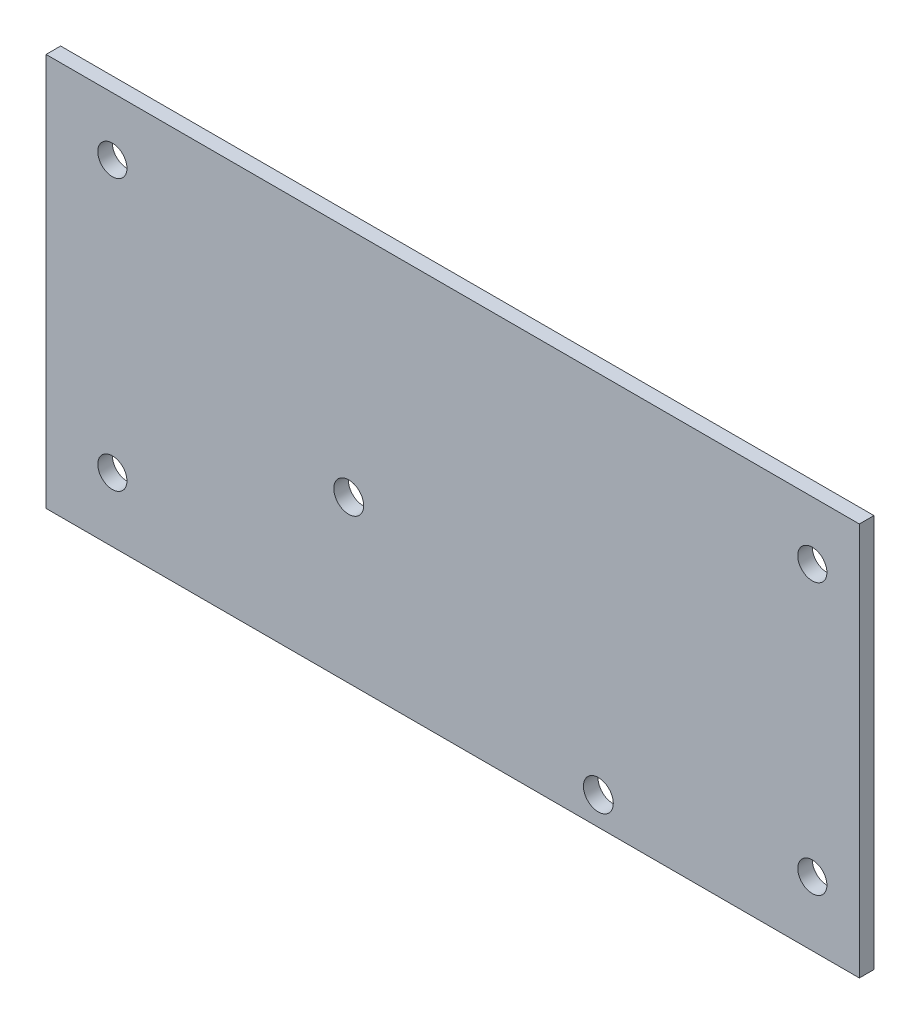
ISO-10303-21;
HEADER;
FILE_DESCRIPTION(('STEP AP214'),'2;1');
FILE_NAME('part.step','',(''),(''),'','','');
FILE_SCHEMA(('AUTOMOTIVE_DESIGN { 1 0 10303 214 1 1 1 1 }'));
ENDSEC;
DATA;
#1=APPLICATION_CONTEXT('core data for automotive mechanical design processes');
#2=APPLICATION_PROTOCOL_DEFINITION('international standard','automotive_design',2000,#1);
#3=PRODUCT_CONTEXT('',#1,'mechanical');
#4=PRODUCT('Part','Part','',(#3));
#5=PRODUCT_RELATED_PRODUCT_CATEGORY('part','',(#4));
#6=PRODUCT_DEFINITION_FORMATION('','',#4);
#7=PRODUCT_DEFINITION_CONTEXT('part definition',#1,'design');
#8=PRODUCT_DEFINITION('design','',#6,#7);
#9=PRODUCT_DEFINITION_SHAPE('','',#8);
#10=(LENGTH_UNIT() NAMED_UNIT(*) SI_UNIT(.MILLI.,.METRE.));
#11=(NAMED_UNIT(*) PLANE_ANGLE_UNIT() SI_UNIT($,.RADIAN.));
#12=(NAMED_UNIT(*) SI_UNIT($,.STERADIAN.) SOLID_ANGLE_UNIT());
#13=UNCERTAINTY_MEASURE_WITH_UNIT(LENGTH_MEASURE(1.E-05),#10,'distance_accuracy_value','');
#14=(GEOMETRIC_REPRESENTATION_CONTEXT(3) GLOBAL_UNCERTAINTY_ASSIGNED_CONTEXT((#13)) GLOBAL_UNIT_ASSIGNED_CONTEXT((#10,
#11,#12)) REPRESENTATION_CONTEXT('',''));
#15=CARTESIAN_POINT('',(0.,0.,0.));
#16=DIRECTION('',(0.,0.,1.));
#17=DIRECTION('',(1.,0.,0.));
#18=AXIS2_PLACEMENT_3D('',#15,#16,#17);
#19=CARTESIAN_POINT('',(0.,0.,3.175));
#20=DIRECTION('',(0.,0.,-1.));
#21=DIRECTION('',(-1.,0.,0.));
#22=AXIS2_PLACEMENT_3D('',#19,#20,#21);
#23=PLANE('',#22);
#24=DIRECTION('',(0.,1.,0.));
#25=VECTOR('',#24,1.);
#26=CARTESIAN_POINT('',(-65.9579664301724,307.498861417681,3.175));
#27=LINE('',#26,#25);
#28=CARTESIAN_POINT('',(-65.9579664301723,221.887142857142,3.175));
#29=VERTEX_POINT('',#28);
#30=CARTESIAN_POINT('',(-65.9579664301724,307.498861417681,3.175));
#31=VERTEX_POINT('',#30);
#32=EDGE_CURVE('E91',#29,#31,#27,.T.);
#33=ORIENTED_EDGE('',*,*,#32,.T.);
#34=DIRECTION('',(-1.,0.,0.));
#35=VECTOR('',#34,1.);
#36=CARTESIAN_POINT('',(-65.9579664301724,307.498861417681,3.175));
#37=LINE('',#36,#35);
#38=CARTESIAN_POINT('',(-243.035671752235,307.498861417681,3.175));
#39=VERTEX_POINT('',#38);
#40=EDGE_CURVE('E86',#31,#39,#37,.T.);
#41=ORIENTED_EDGE('',*,*,#40,.T.);
#42=DIRECTION('',(0.,-1.,0.));
#43=VECTOR('',#42,1.);
#44=CARTESIAN_POINT('',(-243.035671752235,307.498861417681,3.175));
#45=LINE('',#44,#43);
#46=CARTESIAN_POINT('',(-243.035671752235,221.887142857142,3.175));
#47=VERTEX_POINT('',#46);
#48=EDGE_CURVE('E89',#39,#47,#45,.T.);
#49=ORIENTED_EDGE('',*,*,#48,.T.);
#50=DIRECTION('',(1.,0.,0.));
#51=VECTOR('',#50,1.);
#52=CARTESIAN_POINT('',(-65.9579664301723,221.887142857142,3.175));
#53=LINE('',#52,#51);
#54=EDGE_CURVE('E56',#47,#29,#53,.T.);
#55=ORIENTED_EDGE('',*,*,#54,.T.);
#56=EDGE_LOOP('',(#33,#41,#49,#55));
#57=FACE_BOUND('',#56,.T.);
#58=CARTESIAN_POINT('',(-76.200000000001,294.821428571428,3.175));
#59=DIRECTION('',(0.,0.,1.));
#60=DIRECTION('',(1.,0.,0.));
#61=AXIS2_PLACEMENT_3D('',#58,#59,#60);
#62=CIRCLE('',#61,3.175);
#63=CARTESIAN_POINT('',(-73.025000000001,294.821428571428,3.175));
#64=VERTEX_POINT('',#63);
#65=EDGE_CURVE('E106',#64,#64,#62,.T.);
#66=ORIENTED_EDGE('',*,*,#65,.F.);
#67=EDGE_LOOP('',(#66));
#68=FACE_BOUND('',#67,.T.);
#69=CARTESIAN_POINT('',(-76.2000000000008,235.857142857143,3.175));
#70=DIRECTION('',(0.,0.,1.));
#71=DIRECTION('',(1.,0.,0.));
#72=AXIS2_PLACEMENT_3D('',#69,#70,#71);
#73=CIRCLE('',#72,3.17499999999998);
#74=CARTESIAN_POINT('',(-73.0250000000008,235.857142857143,3.175));
#75=VERTEX_POINT('',#74);
#76=EDGE_CURVE('E121',#75,#75,#73,.T.);
#77=ORIENTED_EDGE('',*,*,#76,.F.);
#78=EDGE_LOOP('',(#77));
#79=FACE_BOUND('',#78,.T.);
#80=CARTESIAN_POINT('',(-228.600000000001,294.821428571429,3.175));
#81=DIRECTION('',(0.,0.,1.));
#82=DIRECTION('',(1.,0.,0.));
#83=AXIS2_PLACEMENT_3D('',#80,#81,#82);
#84=CIRCLE('',#83,3.17499999999997);
#85=CARTESIAN_POINT('',(-225.425000000001,294.821428571429,3.175));
#86=VERTEX_POINT('',#85);
#87=EDGE_CURVE('E127',#86,#86,#84,.T.);
#88=ORIENTED_EDGE('',*,*,#87,.F.);
#89=EDGE_LOOP('',(#88));
#90=FACE_BOUND('',#89,.T.);
#91=CARTESIAN_POINT('',(-228.600000000001,235.857142857144,3.175));
#92=DIRECTION('',(0.,0.,1.));
#93=DIRECTION('',(1.,0.,0.));
#94=AXIS2_PLACEMENT_3D('',#91,#92,#93);
#95=CIRCLE('',#94,3.17499999999997);
#96=CARTESIAN_POINT('',(-225.425000000001,235.857142857144,3.175));
#97=VERTEX_POINT('',#96);
#98=EDGE_CURVE('E133',#97,#97,#95,.T.);
#99=ORIENTED_EDGE('',*,*,#98,.F.);
#100=EDGE_LOOP('',(#99));
#101=FACE_BOUND('',#100,.T.);
#102=CARTESIAN_POINT('',(-122.783926368752,228.025735166795,3.175));
#103=DIRECTION('',(0.,0.,1.));
#104=DIRECTION('',(1.,0.,0.));
#105=AXIS2_PLACEMENT_3D('',#102,#103,#104);
#106=CIRCLE('',#105,3.25119999999999);
#107=CARTESIAN_POINT('',(-119.532726368752,228.025735166795,3.175));
#108=VERTEX_POINT('',#107);
#109=EDGE_CURVE('E139',#108,#108,#106,.T.);
#110=ORIENTED_EDGE('',*,*,#109,.F.);
#111=EDGE_LOOP('',(#110));
#112=FACE_BOUND('',#111,.T.);
#113=CARTESIAN_POINT('',(-177.139926368752,256.981735166795,3.175));
#114=DIRECTION('',(0.,0.,1.));
#115=DIRECTION('',(1.,0.,0.));
#116=AXIS2_PLACEMENT_3D('',#113,#114,#115);
#117=CIRCLE('',#116,3.25120000000001);
#118=CARTESIAN_POINT('',(-173.888726368752,256.981735166795,3.175));
#119=VERTEX_POINT('',#118);
#120=EDGE_CURVE('E145',#119,#119,#117,.T.);
#121=ORIENTED_EDGE('',*,*,#120,.F.);
#122=EDGE_LOOP('',(#121));
#123=FACE_BOUND('',#122,.T.);
#124=ADVANCED_FACE('F39',(#57,#68,#79,#90,#101,#112,#123),#23,.F.);
#125=CARTESIAN_POINT('',(0.,0.,0.));
#126=DIRECTION('',(0.,0.,-1.));
#127=DIRECTION('',(-1.,0.,0.));
#128=AXIS2_PLACEMENT_3D('',#125,#126,#127);
#129=PLANE('',#128);
#130=CARTESIAN_POINT('',(-122.783926368752,228.025735166795,0.));
#131=DIRECTION('',(0.,0.,1.));
#132=DIRECTION('',(1.,0.,0.));
#133=AXIS2_PLACEMENT_3D('',#130,#131,#132);
#134=CIRCLE('',#133,3.25119999999999);
#135=CARTESIAN_POINT('',(-119.532726368752,228.025735166795,0.));
#136=VERTEX_POINT('',#135);
#137=EDGE_CURVE('E142',#136,#136,#134,.T.);
#138=ORIENTED_EDGE('',*,*,#137,.T.);
#139=EDGE_LOOP('',(#138));
#140=FACE_BOUND('',#139,.T.);
#141=CARTESIAN_POINT('',(-228.600000000001,294.821428571429,0.));
#142=DIRECTION('',(0.,0.,1.));
#143=DIRECTION('',(1.,0.,0.));
#144=AXIS2_PLACEMENT_3D('',#141,#142,#143);
#145=CIRCLE('',#144,3.17499999999997);
#146=CARTESIAN_POINT('',(-225.425000000001,294.821428571429,0.));
#147=VERTEX_POINT('',#146);
#148=EDGE_CURVE('E130',#147,#147,#145,.T.);
#149=ORIENTED_EDGE('',*,*,#148,.T.);
#150=EDGE_LOOP('',(#149));
#151=FACE_BOUND('',#150,.T.);
#152=CARTESIAN_POINT('',(-76.200000000001,294.821428571428,0.));
#153=DIRECTION('',(0.,0.,1.));
#154=DIRECTION('',(1.,0.,0.));
#155=AXIS2_PLACEMENT_3D('',#152,#153,#154);
#156=CIRCLE('',#155,3.175);
#157=CARTESIAN_POINT('',(-73.025000000001,294.821428571428,0.));
#158=VERTEX_POINT('',#157);
#159=EDGE_CURVE('E118',#158,#158,#156,.T.);
#160=ORIENTED_EDGE('',*,*,#159,.T.);
#161=EDGE_LOOP('',(#160));
#162=FACE_BOUND('',#161,.T.);
#163=DIRECTION('',(0.,1.,0.));
#164=VECTOR('',#163,1.);
#165=CARTESIAN_POINT('',(-65.9579664301724,307.498861417681,0.));
#166=LINE('',#165,#164);
#167=CARTESIAN_POINT('',(-65.9579664301723,221.887142857142,0.));
#168=VERTEX_POINT('',#167);
#169=CARTESIAN_POINT('',(-65.9579664301724,307.498861417681,0.));
#170=VERTEX_POINT('',#169);
#171=EDGE_CURVE('E103',#168,#170,#166,.T.);
#172=ORIENTED_EDGE('',*,*,#171,.F.);
#173=DIRECTION('',(1.,0.,0.));
#174=VECTOR('',#173,1.);
#175=CARTESIAN_POINT('',(-65.9579664301723,221.887142857142,0.));
#176=LINE('',#175,#174);
#177=CARTESIAN_POINT('',(-243.035671752235,221.887142857142,0.));
#178=VERTEX_POINT('',#177);
#179=EDGE_CURVE('E79',#178,#168,#176,.T.);
#180=ORIENTED_EDGE('',*,*,#179,.F.);
#181=DIRECTION('',(0.,-1.,0.));
#182=VECTOR('',#181,1.);
#183=CARTESIAN_POINT('',(-243.035671752235,307.498861417681,0.));
#184=LINE('',#183,#182);
#185=CARTESIAN_POINT('',(-243.035671752235,307.498861417681,0.));
#186=VERTEX_POINT('',#185);
#187=EDGE_CURVE('E73',#186,#178,#184,.T.);
#188=ORIENTED_EDGE('',*,*,#187,.F.);
#189=DIRECTION('',(-1.,0.,0.));
#190=VECTOR('',#189,1.);
#191=CARTESIAN_POINT('',(-65.9579664301724,307.498861417681,0.));
#192=LINE('',#191,#190);
#193=EDGE_CURVE('E95',#170,#186,#192,.T.);
#194=ORIENTED_EDGE('',*,*,#193,.F.);
#195=EDGE_LOOP('',(#172,#180,#188,#194));
#196=FACE_BOUND('',#195,.T.);
#197=CARTESIAN_POINT('',(-76.2000000000008,235.857142857143,0.));
#198=DIRECTION('',(0.,0.,1.));
#199=DIRECTION('',(1.,0.,0.));
#200=AXIS2_PLACEMENT_3D('',#197,#198,#199);
#201=CIRCLE('',#200,3.17499999999998);
#202=CARTESIAN_POINT('',(-73.0250000000008,235.857142857143,0.));
#203=VERTEX_POINT('',#202);
#204=EDGE_CURVE('E124',#203,#203,#201,.T.);
#205=ORIENTED_EDGE('',*,*,#204,.T.);
#206=EDGE_LOOP('',(#205));
#207=FACE_BOUND('',#206,.T.);
#208=CARTESIAN_POINT('',(-228.600000000001,235.857142857144,0.));
#209=DIRECTION('',(0.,0.,1.));
#210=DIRECTION('',(1.,0.,0.));
#211=AXIS2_PLACEMENT_3D('',#208,#209,#210);
#212=CIRCLE('',#211,3.17499999999997);
#213=CARTESIAN_POINT('',(-225.425000000001,235.857142857144,0.));
#214=VERTEX_POINT('',#213);
#215=EDGE_CURVE('E136',#214,#214,#212,.T.);
#216=ORIENTED_EDGE('',*,*,#215,.T.);
#217=EDGE_LOOP('',(#216));
#218=FACE_BOUND('',#217,.T.);
#219=CARTESIAN_POINT('',(-177.139926368752,256.981735166795,0.));
#220=DIRECTION('',(0.,0.,1.));
#221=DIRECTION('',(1.,0.,0.));
#222=AXIS2_PLACEMENT_3D('',#219,#220,#221);
#223=CIRCLE('',#222,3.25120000000001);
#224=CARTESIAN_POINT('',(-173.888726368752,256.981735166795,0.));
#225=VERTEX_POINT('',#224);
#226=EDGE_CURVE('E148',#225,#225,#223,.T.);
#227=ORIENTED_EDGE('',*,*,#226,.T.);
#228=EDGE_LOOP('',(#227));
#229=FACE_BOUND('',#228,.T.);
#230=ADVANCED_FACE('F114',(#140,#151,#162,#196,#207,#218,#229),#129,.T.);
#231=CARTESIAN_POINT('',(-65.9579664301724,307.498861417681,3.175));
#232=DIRECTION('',(-1.,0.,0.));
#233=DIRECTION('',(0.,-1.,0.));
#234=AXIS2_PLACEMENT_3D('',#231,#232,#233);
#235=PLANE('',#234);
#236=ORIENTED_EDGE('',*,*,#171,.T.);
#237=DIRECTION('',(0.,0.,-1.));
#238=VECTOR('',#237,1.);
#239=CARTESIAN_POINT('',(-65.9579664301724,307.498861417681,3.175));
#240=LINE('',#239,#238);
#241=EDGE_CURVE('E11',#31,#170,#240,.T.);
#242=ORIENTED_EDGE('',*,*,#241,.F.);
#243=ORIENTED_EDGE('',*,*,#32,.F.);
#244=DIRECTION('',(0.,0.,-1.));
#245=VECTOR('',#244,1.);
#246=CARTESIAN_POINT('',(-65.9579664301723,221.887142857142,3.175));
#247=LINE('',#246,#245);
#248=EDGE_CURVE('E99',#29,#168,#247,.T.);
#249=ORIENTED_EDGE('',*,*,#248,.T.);
#250=EDGE_LOOP('',(#236,#242,#243,#249));
#251=FACE_BOUND('',#250,.T.);
#252=ADVANCED_FACE('F41',(#251),#235,.F.);
#253=CARTESIAN_POINT('',(-65.9579664301724,307.498861417681,3.175));
#254=DIRECTION('',(0.,-1.,0.));
#255=DIRECTION('',(0.,0.,-1.));
#256=AXIS2_PLACEMENT_3D('',#253,#254,#255);
#257=PLANE('',#256);
#258=ORIENTED_EDGE('',*,*,#193,.T.);
#259=DIRECTION('',(0.,0.,-1.));
#260=VECTOR('',#259,1.);
#261=CARTESIAN_POINT('',(-243.035671752235,307.498861417681,3.175));
#262=LINE('',#261,#260);
#263=EDGE_CURVE('E48',#39,#186,#262,.T.);
#264=ORIENTED_EDGE('',*,*,#263,.F.);
#265=ORIENTED_EDGE('',*,*,#40,.F.);
#266=ORIENTED_EDGE('',*,*,#241,.T.);
#267=EDGE_LOOP('',(#258,#264,#265,#266));
#268=FACE_BOUND('',#267,.T.);
#269=ADVANCED_FACE('F94',(#268),#257,.F.);
#270=CARTESIAN_POINT('',(-243.035671752235,307.498861417681,3.175));
#271=DIRECTION('',(1.,0.,0.));
#272=DIRECTION('',(0.,0.,-1.));
#273=AXIS2_PLACEMENT_3D('',#270,#271,#272);
#274=PLANE('',#273);
#275=ORIENTED_EDGE('',*,*,#187,.T.);
#276=DIRECTION('',(0.,0.,-1.));
#277=VECTOR('',#276,1.);
#278=CARTESIAN_POINT('',(-243.035671752235,221.887142857142,3.175));
#279=LINE('',#278,#277);
#280=EDGE_CURVE('E96',#47,#178,#279,.T.);
#281=ORIENTED_EDGE('',*,*,#280,.F.);
#282=ORIENTED_EDGE('',*,*,#48,.F.);
#283=ORIENTED_EDGE('',*,*,#263,.T.);
#284=EDGE_LOOP('',(#275,#281,#282,#283));
#285=FACE_BOUND('',#284,.T.);
#286=ADVANCED_FACE('F97',(#285),#274,.F.);
#287=CARTESIAN_POINT('',(-65.9579664301723,221.887142857142,3.175));
#288=DIRECTION('',(0.,1.,0.));
#289=DIRECTION('',(0.,0.,1.));
#290=AXIS2_PLACEMENT_3D('',#287,#288,#289);
#291=PLANE('',#290);
#292=ORIENTED_EDGE('',*,*,#179,.T.);
#293=ORIENTED_EDGE('',*,*,#248,.F.);
#294=ORIENTED_EDGE('',*,*,#54,.F.);
#295=ORIENTED_EDGE('',*,*,#280,.T.);
#296=EDGE_LOOP('',(#292,#293,#294,#295));
#297=FACE_BOUND('',#296,.T.);
#298=ADVANCED_FACE('F111',(#297),#291,.F.);
#299=CARTESIAN_POINT('',(-76.200000000001,294.821428571428,3.175));
#300=DIRECTION('',(0.,0.,-1.));
#301=DIRECTION('',(-1.,0.,0.));
#302=AXIS2_PLACEMENT_3D('',#299,#300,#301);
#303=CYLINDRICAL_SURFACE('',#302,3.175);
#304=ORIENTED_EDGE('',*,*,#65,.T.);
#305=EDGE_LOOP('',(#304));
#306=FACE_BOUND('',#305,.T.);
#307=ORIENTED_EDGE('',*,*,#159,.F.);
#308=EDGE_LOOP('',(#307));
#309=FACE_BOUND('',#308,.T.);
#310=ADVANCED_FACE('F165',(#306,#309),#303,.F.);
#311=CARTESIAN_POINT('',(-76.2000000000008,235.857142857143,3.175));
#312=DIRECTION('',(0.,0.,-1.));
#313=DIRECTION('',(-1.,0.,0.));
#314=AXIS2_PLACEMENT_3D('',#311,#312,#313);
#315=CYLINDRICAL_SURFACE('',#314,3.17499999999998);
#316=ORIENTED_EDGE('',*,*,#76,.T.);
#317=EDGE_LOOP('',(#316));
#318=FACE_BOUND('',#317,.T.);
#319=ORIENTED_EDGE('',*,*,#204,.F.);
#320=EDGE_LOOP('',(#319));
#321=FACE_BOUND('',#320,.T.);
#322=ADVANCED_FACE('F210',(#318,#321),#315,.F.);
#323=CARTESIAN_POINT('',(-228.600000000001,294.821428571429,3.175));
#324=DIRECTION('',(0.,0.,-1.));
#325=DIRECTION('',(-1.,0.,0.));
#326=AXIS2_PLACEMENT_3D('',#323,#324,#325);
#327=CYLINDRICAL_SURFACE('',#326,3.17499999999997);
#328=ORIENTED_EDGE('',*,*,#87,.T.);
#329=EDGE_LOOP('',(#328));
#330=FACE_BOUND('',#329,.T.);
#331=ORIENTED_EDGE('',*,*,#148,.F.);
#332=EDGE_LOOP('',(#331));
#333=FACE_BOUND('',#332,.T.);
#334=ADVANCED_FACE('F218',(#330,#333),#327,.F.);
#335=CARTESIAN_POINT('',(-228.600000000001,235.857142857144,3.175));
#336=DIRECTION('',(0.,0.,-1.));
#337=DIRECTION('',(-1.,0.,0.));
#338=AXIS2_PLACEMENT_3D('',#335,#336,#337);
#339=CYLINDRICAL_SURFACE('',#338,3.17499999999997);
#340=ORIENTED_EDGE('',*,*,#98,.T.);
#341=EDGE_LOOP('',(#340));
#342=FACE_BOUND('',#341,.T.);
#343=ORIENTED_EDGE('',*,*,#215,.F.);
#344=EDGE_LOOP('',(#343));
#345=FACE_BOUND('',#344,.T.);
#346=ADVANCED_FACE('F226',(#342,#345),#339,.F.);
#347=CARTESIAN_POINT('',(-122.783926368752,228.025735166795,3.175));
#348=DIRECTION('',(0.,0.,-1.));
#349=DIRECTION('',(-1.,0.,0.));
#350=AXIS2_PLACEMENT_3D('',#347,#348,#349);
#351=CYLINDRICAL_SURFACE('',#350,3.25119999999999);
#352=ORIENTED_EDGE('',*,*,#109,.T.);
#353=EDGE_LOOP('',(#352));
#354=FACE_BOUND('',#353,.T.);
#355=ORIENTED_EDGE('',*,*,#137,.F.);
#356=EDGE_LOOP('',(#355));
#357=FACE_BOUND('',#356,.T.);
#358=ADVANCED_FACE('F235',(#354,#357),#351,.F.);
#359=CARTESIAN_POINT('',(-177.139926368752,256.981735166795,3.175));
#360=DIRECTION('',(0.,0.,-1.));
#361=DIRECTION('',(-1.,0.,0.));
#362=AXIS2_PLACEMENT_3D('',#359,#360,#361);
#363=CYLINDRICAL_SURFACE('',#362,3.25120000000001);
#364=ORIENTED_EDGE('',*,*,#120,.T.);
#365=EDGE_LOOP('',(#364));
#366=FACE_BOUND('',#365,.T.);
#367=ORIENTED_EDGE('',*,*,#226,.F.);
#368=EDGE_LOOP('',(#367));
#369=FACE_BOUND('',#368,.T.);
#370=ADVANCED_FACE('F154',(#366,#369),#363,.F.);
#371=CLOSED_SHELL('',(#124,#230,#252,#269,#286,#298,#310,#322,#334,#346,#358,#370));
#372=MANIFOLD_SOLID_BREP('B2',#371);
#373=ADVANCED_BREP_SHAPE_REPRESENTATION('',(#18,#372),#14);
#374=SHAPE_DEFINITION_REPRESENTATION(#9,#373);
ENDSEC;
END-ISO-10303-21;
